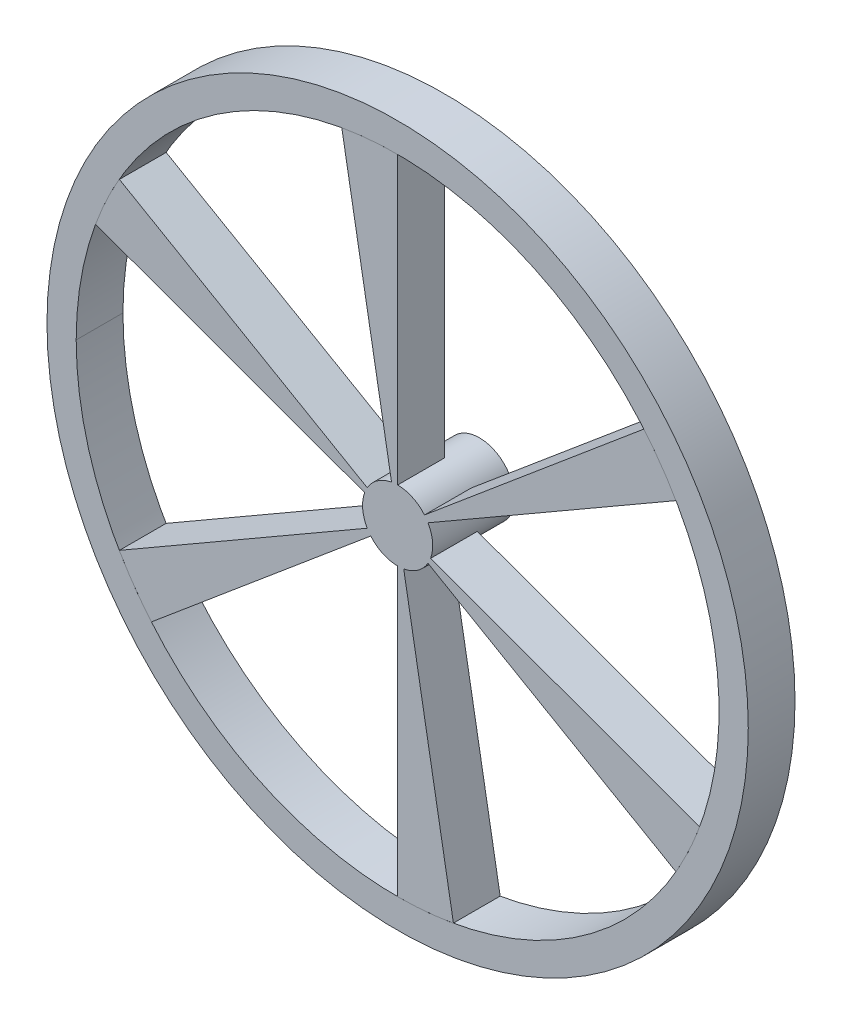
ISO-10303-21;
HEADER;
FILE_DESCRIPTION(('STEP AP214'),'2;1');
FILE_NAME('part.step','',(''),(''),'','','');
FILE_SCHEMA(('AUTOMOTIVE_DESIGN { 1 0 10303 214 1 1 1 1 }'));
ENDSEC;
DATA;
#1=APPLICATION_CONTEXT('core data for automotive mechanical design processes');
#2=APPLICATION_PROTOCOL_DEFINITION('international standard','automotive_design',2000,#1);
#3=PRODUCT_CONTEXT('',#1,'mechanical');
#4=PRODUCT('Part','Part','',(#3));
#5=PRODUCT_RELATED_PRODUCT_CATEGORY('part','',(#4));
#6=PRODUCT_DEFINITION_FORMATION('','',#4);
#7=PRODUCT_DEFINITION_CONTEXT('part definition',#1,'design');
#8=PRODUCT_DEFINITION('design','',#6,#7);
#9=PRODUCT_DEFINITION_SHAPE('','',#8);
#10=(LENGTH_UNIT() NAMED_UNIT(*) SI_UNIT(.MILLI.,.METRE.));
#11=(NAMED_UNIT(*) PLANE_ANGLE_UNIT() SI_UNIT($,.RADIAN.));
#12=(NAMED_UNIT(*) SI_UNIT($,.STERADIAN.) SOLID_ANGLE_UNIT());
#13=UNCERTAINTY_MEASURE_WITH_UNIT(LENGTH_MEASURE(1.E-05),#10,'distance_accuracy_value','');
#14=(GEOMETRIC_REPRESENTATION_CONTEXT(3) GLOBAL_UNCERTAINTY_ASSIGNED_CONTEXT((#13)) GLOBAL_UNIT_ASSIGNED_CONTEXT((#10,
#11,#12)) REPRESENTATION_CONTEXT('',''));
#15=CARTESIAN_POINT('',(0.,0.,0.));
#16=DIRECTION('',(0.,0.,1.));
#17=DIRECTION('',(1.,0.,0.));
#18=AXIS2_PLACEMENT_3D('',#15,#16,#17);
#19=CARTESIAN_POINT('',(0.,-660.141421356237,0.));
#20=DIRECTION('',(0.,0.,1.));
#21=DIRECTION('',(1.,0.,0.));
#22=AXIS2_PLACEMENT_3D('',#19,#20,#21);
#23=PLANE('',#22);
#24=CARTESIAN_POINT('',(0.,0.,0.));
#25=DIRECTION('',(0.,0.,-1.));
#26=DIRECTION('',(-1.,0.,0.));
#27=AXIS2_PLACEMENT_3D('',#24,#25,#26);
#28=CIRCLE('',#27,30.);
#29=CARTESIAN_POINT('',(-28.1901049146424,10.2624551108131,0.));
#30=VERTEX_POINT('',#29);
#31=CARTESIAN_POINT('',(-25.9802620990994,15.0008660170704,0.));
#32=VERTEX_POINT('',#31);
#33=EDGE_CURVE('E359',#30,#32,#28,.T.);
#34=ORIENTED_EDGE('',*,*,#33,.F.);
#35=DIRECTION('',(-0.939692620785909,0.342020143325668,0.));
#36=VECTOR('',#35,1.);
#37=CARTESIAN_POINT('',(212.166036792502,-77.2200260936567,0.));
#38=LINE('',#37,#36);
#39=CARTESIAN_POINT('',(-258.41303102068,94.0567474590781,0.));
#40=VERTEX_POINT('',#39);
#41=EDGE_CURVE('E297',#30,#40,#38,.T.);
#42=ORIENTED_EDGE('',*,*,#41,.T.);
#43=CARTESIAN_POINT('',(0.002,0.,0.));
#44=DIRECTION('',(0.,0.,1.));
#45=DIRECTION('',(1.,0.,0.));
#46=AXIS2_PLACEMENT_3D('',#43,#44,#45);
#47=CIRCLE('',#46,275.);
#48=CARTESIAN_POINT('',(-238.154986040721,137.5,0.));
#49=VERTEX_POINT('',#48);
#50=EDGE_CURVE('E294',#49,#40,#47,.T.);
#51=ORIENTED_EDGE('',*,*,#50,.F.);
#52=DIRECTION('',(-0.866025403784439,0.5,0.));
#53=VECTOR('',#52,1.);
#54=CARTESIAN_POINT('',(285.850120492434,-165.034489313656,0.));
#55=LINE('',#54,#53);
#56=EDGE_CURVE('E298',#32,#49,#55,.T.);
#57=ORIENTED_EDGE('',*,*,#56,.F.);
#58=EDGE_LOOP('',(#34,#42,#51,#57));
#59=FACE_BOUND('',#58,.T.);
#60=ADVANCED_FACE('F121',(#59),#23,.F.);
#61=CARTESIAN_POINT('',(-5.20750562615966,29.5445745468354,0.));
#62=VERTEX_POINT('',#61);
#63=CARTESIAN_POINT('',(0.000999999999722214,29.9999999833333,0.));
#64=VERTEX_POINT('',#63);
#65=EDGE_CURVE('E13',#62,#64,#28,.T.);
#66=ORIENTED_EDGE('',*,*,#65,.F.);
#67=DIRECTION('',(-0.173648177666931,0.984807753012208,0.));
#68=VECTOR('',#67,1.);
#69=CARTESIAN_POINT('',(112.892771466357,-640.235379819764,0.));
#70=LINE('',#69,#68);
#71=CARTESIAN_POINT('',(-47.7511080016003,270.821333239715,0.));
#72=VERTEX_POINT('',#71);
#73=EDGE_CURVE('E292',#62,#72,#70,.T.);
#74=ORIENTED_EDGE('',*,*,#73,.T.);
#75=CARTESIAN_POINT('',(0.00099999999999999,-0.001,0.));
#76=DIRECTION('',(0.,0.,1.));
#77=DIRECTION('',(1.,0.,0.));
#78=AXIS2_PLACEMENT_3D('',#75,#76,#77);
#79=CIRCLE('',#78,275.);
#80=CARTESIAN_POINT('',(0.000999999999999992,274.999,0.));
#81=VERTEX_POINT('',#80);
#82=EDGE_CURVE('E289',#81,#72,#79,.T.);
#83=ORIENTED_EDGE('',*,*,#82,.F.);
#84=DIRECTION('',(0.,1.,0.));
#85=VECTOR('',#84,1.);
#86=CARTESIAN_POINT('',(0.000999999999999992,-660.141421356237,0.));
#87=LINE('',#86,#85);
#88=EDGE_CURVE('E293',#64,#81,#87,.T.);
#89=ORIENTED_EDGE('',*,*,#88,.F.);
#90=EDGE_LOOP('',(#66,#74,#83,#89));
#91=FACE_BOUND('',#90,.T.);
#92=ADVANCED_FACE('F520',(#91),#23,.F.);
#93=CARTESIAN_POINT('',(22.9825992884827,19.2821194360224,0.));
#94=VERTEX_POINT('',#93);
#95=CARTESIAN_POINT('',(25.9812620990994,14.9991339662629,0.));
#96=VERTEX_POINT('',#95);
#97=EDGE_CURVE('E131',#94,#96,#28,.T.);
#98=ORIENTED_EDGE('',*,*,#97,.F.);
#99=DIRECTION('',(0.766044443118977,0.64278760968654,0.));
#100=VECTOR('',#99,1.);
#101=CARTESIAN_POINT('',(-325.054928873618,-272.756042080649,0.));
#102=LINE('',#101,#100);
#103=CARTESIAN_POINT('',(210.663582321936,176.765163078383,0.));
#104=VERTEX_POINT('',#103);
#105=EDGE_CURVE('E315',#94,#104,#102,.T.);
#106=ORIENTED_EDGE('',*,*,#105,.T.);
#107=CARTESIAN_POINT('',(0.00099999999999999,-0.001,0.));
#108=DIRECTION('',(0.,0.,1.));
#109=DIRECTION('',(1.,0.,0.));
#110=AXIS2_PLACEMENT_3D('',#107,#108,#109);
#111=CIRCLE('',#110,275.);
#112=CARTESIAN_POINT('',(238.157803027808,137.499316987176,0.));
#113=VERTEX_POINT('',#112);
#114=EDGE_CURVE('E275',#113,#104,#111,.T.);
#115=ORIENTED_EDGE('',*,*,#114,.F.);
#116=DIRECTION('',(0.866025403784439,0.5,0.));
#117=VECTOR('',#116,1.);
#118=CARTESIAN_POINT('',(-285.849120492434,-165.036221364463,0.));
#119=LINE('',#118,#117);
#120=EDGE_CURVE('E186',#96,#113,#119,.T.);
#121=ORIENTED_EDGE('',*,*,#120,.F.);
#122=EDGE_LOOP('',(#98,#106,#115,#121));
#123=FACE_BOUND('',#122,.T.);
#124=ADVANCED_FACE('F524',(#123),#23,.F.);
#125=CARTESIAN_POINT('',(28.1901049146425,-10.262455110813,0.));
#126=VERTEX_POINT('',#125);
#127=CARTESIAN_POINT('',(25.9802620990995,-15.0008660170703,0.));
#128=VERTEX_POINT('',#127);
#129=EDGE_CURVE('E372',#126,#128,#28,.T.);
#130=ORIENTED_EDGE('',*,*,#129,.F.);
#131=DIRECTION('',(0.939692620785909,-0.342020143325668,0.));
#132=VECTOR('',#131,1.);
#133=CARTESIAN_POINT('',(212.164689496147,-77.2237277599702,0.));
#134=LINE('',#133,#132);
#135=CARTESIAN_POINT('',(258.415358678303,-94.0575946571681,0.));
#136=VERTEX_POINT('',#135);
#137=EDGE_CURVE('E313',#126,#136,#134,.T.);
#138=ORIENTED_EDGE('',*,*,#137,.T.);
#139=CARTESIAN_POINT('',(0.001,0.001,0.));
#140=DIRECTION('',(0.,0.,1.));
#141=DIRECTION('',(1.,0.,0.));
#142=AXIS2_PLACEMENT_3D('',#139,#140,#141);
#143=CIRCLE('',#142,275.);
#144=CARTESIAN_POINT('',(238.156803019204,-137.501049033016,0.));
#145=VERTEX_POINT('',#144);
#146=EDGE_CURVE('E310',#145,#136,#143,.T.);
#147=ORIENTED_EDGE('',*,*,#146,.F.);
#148=DIRECTION('',(0.866025403784439,-0.5,0.));
#149=VECTOR('',#148,1.);
#150=CARTESIAN_POINT('',(285.849120492434,-165.036221364463,0.));
#151=LINE('',#150,#149);
#152=EDGE_CURVE('E314',#128,#145,#151,.T.);
#153=ORIENTED_EDGE('',*,*,#152,.F.);
#154=EDGE_LOOP('',(#130,#138,#147,#153));
#155=FACE_BOUND('',#154,.T.);
#156=ADVANCED_FACE('F532',(#155),#23,.F.);
#157=CARTESIAN_POINT('',(5.20750562615971,-29.5445745468354,0.));
#158=VERTEX_POINT('',#157);
#159=CARTESIAN_POINT('',(-0.000999999999665977,-29.9999999833333,0.));
#160=VERTEX_POINT('',#159);
#161=EDGE_CURVE('E376',#158,#160,#28,.T.);
#162=ORIENTED_EDGE('',*,*,#161,.F.);
#163=DIRECTION('',(0.173648177666931,-0.984807753012208,0.));
#164=VECTOR('',#163,1.);
#165=CARTESIAN_POINT('',(112.888892081115,-640.23606386005,0.));
#166=LINE('',#165,#164);
#167=CARTESIAN_POINT('',(47.751168306314,-270.821675244741,0.));
#168=VERTEX_POINT('',#167);
#169=EDGE_CURVE('E308',#158,#168,#166,.T.);
#170=ORIENTED_EDGE('',*,*,#169,.T.);
#171=CARTESIAN_POINT('',(0.001,0.001,0.));
#172=DIRECTION('',(0.,0.,1.));
#173=DIRECTION('',(1.,0.,0.));
#174=AXIS2_PLACEMENT_3D('',#171,#172,#173);
#175=CIRCLE('',#174,275.);
#176=CARTESIAN_POINT('',(-0.000999999999896918,-274.998999992727,0.));
#177=VERTEX_POINT('',#176);
#178=EDGE_CURVE('E305',#177,#168,#175,.T.);
#179=ORIENTED_EDGE('',*,*,#178,.F.);
#180=DIRECTION('',(0.,-1.,0.));
#181=VECTOR('',#180,1.);
#182=CARTESIAN_POINT('',(-0.00099999999974966,-660.141421356237,0.));
#183=LINE('',#182,#181);
#184=EDGE_CURVE('E309',#160,#177,#183,.T.);
#185=ORIENTED_EDGE('',*,*,#184,.F.);
#186=EDGE_LOOP('',(#162,#170,#179,#185));
#187=FACE_BOUND('',#186,.T.);
#188=ADVANCED_FACE('F526',(#187),#23,.F.);
#189=CARTESIAN_POINT('',(-22.9825992884827,-19.2821194360225,0.));
#190=VERTEX_POINT('',#189);
#191=CARTESIAN_POINT('',(-25.9812620990994,-14.9991339662629,0.));
#192=VERTEX_POINT('',#191);
#193=EDGE_CURVE('E352',#190,#192,#28,.T.);
#194=ORIENTED_EDGE('',*,*,#193,.F.);
#195=DIRECTION('',(-0.766044443118977,-0.64278760968654,0.));
#196=VECTOR('',#195,1.);
#197=CARTESIAN_POINT('',(-325.057460962504,-272.753024454622,0.));
#198=LINE('',#197,#196);
#199=CARTESIAN_POINT('',(-210.662314239226,-176.764099030648,0.));
#200=VERTEX_POINT('',#199);
#201=EDGE_CURVE('E303',#190,#200,#198,.T.);
#202=ORIENTED_EDGE('',*,*,#201,.T.);
#203=CARTESIAN_POINT('',(0.002,0.,0.));
#204=DIRECTION('',(0.,0.,1.));
#205=DIRECTION('',(1.,0.,0.));
#206=AXIS2_PLACEMENT_3D('',#203,#204,#205);
#207=CIRCLE('',#206,275.);
#208=CARTESIAN_POINT('',(-238.155986034422,-137.498267945556,0.));
#209=VERTEX_POINT('',#208);
#210=EDGE_CURVE('E299',#209,#200,#207,.T.);
#211=ORIENTED_EDGE('',*,*,#210,.F.);
#212=DIRECTION('',(-0.866025403784438,-0.5,0.));
#213=VECTOR('',#212,1.);
#214=CARTESIAN_POINT('',(-285.850120492435,-165.034489313656,0.));
#215=LINE('',#214,#213);
#216=EDGE_CURVE('E304',#192,#209,#215,.T.);
#217=ORIENTED_EDGE('',*,*,#216,.F.);
#218=EDGE_LOOP('',(#194,#202,#211,#217));
#219=FACE_BOUND('',#218,.T.);
#220=ADVANCED_FACE('F420',(#219),#23,.F.);
#221=CARTESIAN_POINT('',(0.000999999999999992,-660.141421356237,40.));
#222=DIRECTION('',(-1.,0.,0.));
#223=DIRECTION('',(0.,0.,1.));
#224=AXIS2_PLACEMENT_3D('',#221,#222,#223);
#225=PLANE('',#224);
#226=ORIENTED_EDGE('',*,*,#88,.T.);
#227=DIRECTION('',(0.,0.,-1.));
#228=VECTOR('',#227,1.);
#229=CARTESIAN_POINT('',(0.000999999999999992,274.999,40.));
#230=LINE('',#229,#228);
#231=CARTESIAN_POINT('',(0.000999999999999992,274.999,40.));
#232=VERTEX_POINT('',#231);
#233=EDGE_CURVE('E349',#232,#81,#230,.T.);
#234=ORIENTED_EDGE('',*,*,#233,.F.);
#235=DIRECTION('',(0.,1.,0.));
#236=VECTOR('',#235,1.);
#237=CARTESIAN_POINT('',(0.000999999999999992,-660.141421356237,40.));
#238=LINE('',#237,#236);
#239=CARTESIAN_POINT('',(0.000999999999999992,29.9999999833333,40.));
#240=VERTEX_POINT('',#239);
#241=EDGE_CURVE('E601',#240,#232,#238,.T.);
#242=ORIENTED_EDGE('',*,*,#241,.F.);
#243=DIRECTION('',(0.,0.,-1.));
#244=VECTOR('',#243,1.);
#245=CARTESIAN_POINT('',(0.000999999999999992,29.9999999833333,40.));
#246=LINE('',#245,#244);
#247=EDGE_CURVE('E283',#240,#64,#246,.T.);
#248=ORIENTED_EDGE('',*,*,#247,.T.);
#249=EDGE_LOOP('',(#226,#234,#242,#248));
#250=FACE_BOUND('',#249,.T.);
#251=ADVANCED_FACE('F123',(#250),#225,.F.);
#252=CARTESIAN_POINT('',(0.00099999999999999,-0.001,40.));
#253=DIRECTION('',(0.,0.,-1.));
#254=DIRECTION('',(-1.,0.,0.));
#255=AXIS2_PLACEMENT_3D('',#252,#253,#254);
#256=CYLINDRICAL_SURFACE('',#255,275.);
#257=ORIENTED_EDGE('',*,*,#82,.T.);
#258=DIRECTION('',(0.,0.,-1.));
#259=VECTOR('',#258,1.);
#260=CARTESIAN_POINT('',(-47.7511080016003,270.821333239715,40.));
#261=LINE('',#260,#259);
#262=CARTESIAN_POINT('',(-47.7511080016003,270.821333239715,40.));
#263=VERTEX_POINT('',#262);
#264=EDGE_CURVE('E347',#263,#72,#261,.T.);
#265=ORIENTED_EDGE('',*,*,#264,.F.);
#266=CARTESIAN_POINT('',(0.00099999999999999,-0.001,40.));
#267=DIRECTION('',(0.,0.,1.));
#268=DIRECTION('',(1.,0.,0.));
#269=AXIS2_PLACEMENT_3D('',#266,#267,#268);
#270=CIRCLE('',#269,275.);
#271=EDGE_CURVE('E203',#232,#263,#270,.T.);
#272=ORIENTED_EDGE('',*,*,#271,.F.);
#273=ORIENTED_EDGE('',*,*,#233,.T.);
#274=EDGE_LOOP('',(#257,#265,#272,#273));
#275=FACE_BOUND('',#274,.T.);
#276=ADVANCED_FACE('F531',(#275),#256,.T.);
#277=CARTESIAN_POINT('',(112.892771466357,-640.235379819764,40.));
#278=DIRECTION('',(-0.984807753012208,-0.173648177666931,0.));
#279=DIRECTION('',(0.173648177666931,-0.984807753012208,0.));
#280=AXIS2_PLACEMENT_3D('',#277,#278,#279);
#281=PLANE('',#280);
#282=ORIENTED_EDGE('',*,*,#73,.F.);
#283=DIRECTION('',(0.,0.,-1.));
#284=VECTOR('',#283,1.);
#285=CARTESIAN_POINT('',(-5.20750562615966,29.5445745468354,40.));
#286=LINE('',#285,#284);
#287=CARTESIAN_POINT('',(-5.20750562615966,29.5445745468354,40.));
#288=VERTEX_POINT('',#287);
#289=EDGE_CURVE('E350',#288,#62,#286,.T.);
#290=ORIENTED_EDGE('',*,*,#289,.F.);
#291=DIRECTION('',(-0.173648177666931,0.984807753012208,0.));
#292=VECTOR('',#291,1.);
#293=CARTESIAN_POINT('',(112.892771466357,-640.235379819764,40.));
#294=LINE('',#293,#292);
#295=EDGE_CURVE('E613',#288,#263,#294,.T.);
#296=ORIENTED_EDGE('',*,*,#295,.T.);
#297=ORIENTED_EDGE('',*,*,#264,.T.);
#298=EDGE_LOOP('',(#282,#290,#296,#297));
#299=FACE_BOUND('',#298,.T.);
#300=ADVANCED_FACE('F616',(#299),#281,.T.);
#301=CARTESIAN_POINT('',(285.850120492434,-165.034489313656,40.));
#302=DIRECTION('',(-0.5,-0.866025403784439,0.));
#303=DIRECTION('',(0.866025403784439,-0.5,0.));
#304=AXIS2_PLACEMENT_3D('',#301,#302,#303);
#305=PLANE('',#304);
#306=ORIENTED_EDGE('',*,*,#56,.T.);
#307=DIRECTION('',(0.,0.,-1.));
#308=VECTOR('',#307,1.);
#309=CARTESIAN_POINT('',(-238.154986040721,137.5,40.));
#310=LINE('',#309,#308);
#311=CARTESIAN_POINT('',(-238.154986040721,137.5,40.));
#312=VERTEX_POINT('',#311);
#313=EDGE_CURVE('E342',#312,#49,#310,.T.);
#314=ORIENTED_EDGE('',*,*,#313,.F.);
#315=DIRECTION('',(-0.866025403784439,0.5,0.));
#316=VECTOR('',#315,1.);
#317=CARTESIAN_POINT('',(285.850120492434,-165.034489313656,40.));
#318=LINE('',#317,#316);
#319=CARTESIAN_POINT('',(-25.9802620990994,15.0008660170704,40.));
#320=VERTEX_POINT('',#319);
#321=EDGE_CURVE('E618',#320,#312,#318,.T.);
#322=ORIENTED_EDGE('',*,*,#321,.F.);
#323=DIRECTION('',(0.,0.,-1.));
#324=VECTOR('',#323,1.);
#325=CARTESIAN_POINT('',(-25.9802620990994,15.0008660170704,40.));
#326=LINE('',#325,#324);
#327=EDGE_CURVE('E346',#320,#32,#326,.T.);
#328=ORIENTED_EDGE('',*,*,#327,.T.);
#329=EDGE_LOOP('',(#306,#314,#322,#328));
#330=FACE_BOUND('',#329,.T.);
#331=ADVANCED_FACE('F627',(#330),#305,.F.);
#332=CARTESIAN_POINT('',(0.002,0.,40.));
#333=DIRECTION('',(0.,0.,-1.));
#334=DIRECTION('',(-1.,0.,0.));
#335=AXIS2_PLACEMENT_3D('',#332,#333,#334);
#336=CYLINDRICAL_SURFACE('',#335,275.);
#337=ORIENTED_EDGE('',*,*,#50,.T.);
#338=DIRECTION('',(0.,0.,-1.));
#339=VECTOR('',#338,1.);
#340=CARTESIAN_POINT('',(-258.41303102068,94.0567474590781,40.));
#341=LINE('',#340,#339);
#342=CARTESIAN_POINT('',(-258.41303102068,94.0567474590781,40.));
#343=VERTEX_POINT('',#342);
#344=EDGE_CURVE('E340',#343,#40,#341,.T.);
#345=ORIENTED_EDGE('',*,*,#344,.F.);
#346=CARTESIAN_POINT('',(0.002,0.,40.));
#347=DIRECTION('',(0.,0.,1.));
#348=DIRECTION('',(1.,0.,0.));
#349=AXIS2_PLACEMENT_3D('',#346,#347,#348);
#350=CIRCLE('',#349,275.);
#351=EDGE_CURVE('E619',#312,#343,#350,.T.);
#352=ORIENTED_EDGE('',*,*,#351,.F.);
#353=ORIENTED_EDGE('',*,*,#313,.T.);
#354=EDGE_LOOP('',(#337,#345,#352,#353));
#355=FACE_BOUND('',#354,.T.);
#356=ADVANCED_FACE('F626',(#355),#336,.T.);
#357=CARTESIAN_POINT('',(212.166036792502,-77.2200260936567,40.));
#358=DIRECTION('',(-0.342020143325668,-0.939692620785909,0.));
#359=DIRECTION('',(0.939692620785909,-0.342020143325668,0.));
#360=AXIS2_PLACEMENT_3D('',#357,#358,#359);
#361=PLANE('',#360);
#362=ORIENTED_EDGE('',*,*,#41,.F.);
#363=DIRECTION('',(0.,0.,-1.));
#364=VECTOR('',#363,1.);
#365=CARTESIAN_POINT('',(-28.1901049146424,10.2624551108131,40.));
#366=LINE('',#365,#364);
#367=CARTESIAN_POINT('',(-28.1901049146424,10.2624551108131,40.));
#368=VERTEX_POINT('',#367);
#369=EDGE_CURVE('E343',#368,#30,#366,.T.);
#370=ORIENTED_EDGE('',*,*,#369,.F.);
#371=DIRECTION('',(-0.939692620785909,0.342020143325668,0.));
#372=VECTOR('',#371,1.);
#373=CARTESIAN_POINT('',(212.166036792502,-77.2200260936567,40.));
#374=LINE('',#373,#372);
#375=EDGE_CURVE('E620',#368,#343,#374,.T.);
#376=ORIENTED_EDGE('',*,*,#375,.T.);
#377=ORIENTED_EDGE('',*,*,#344,.T.);
#378=EDGE_LOOP('',(#362,#370,#376,#377));
#379=FACE_BOUND('',#378,.T.);
#380=ADVANCED_FACE('F473',(#379),#361,.T.);
#381=CARTESIAN_POINT('',(-285.850120492435,-165.034489313656,40.));
#382=DIRECTION('',(0.5,-0.866025403784438,0.));
#383=DIRECTION('',(0.866025403784438,0.5,0.));
#384=AXIS2_PLACEMENT_3D('',#381,#382,#383);
#385=PLANE('',#384);
#386=ORIENTED_EDGE('',*,*,#216,.T.);
#387=DIRECTION('',(0.,0.,-1.));
#388=VECTOR('',#387,1.);
#389=CARTESIAN_POINT('',(-238.155986034422,-137.498267945556,40.));
#390=LINE('',#389,#388);
#391=CARTESIAN_POINT('',(-238.155986034422,-137.498267945556,40.));
#392=VERTEX_POINT('',#391);
#393=EDGE_CURVE('E335',#392,#209,#390,.T.);
#394=ORIENTED_EDGE('',*,*,#393,.F.);
#395=DIRECTION('',(-0.866025403784438,-0.5,0.));
#396=VECTOR('',#395,1.);
#397=CARTESIAN_POINT('',(-285.850120492435,-165.034489313656,40.));
#398=LINE('',#397,#396);
#399=CARTESIAN_POINT('',(-25.9812620990994,-14.9991339662629,40.));
#400=VERTEX_POINT('',#399);
#401=EDGE_CURVE('E566',#400,#392,#398,.T.);
#402=ORIENTED_EDGE('',*,*,#401,.F.);
#403=DIRECTION('',(0.,0.,-1.));
#404=VECTOR('',#403,1.);
#405=CARTESIAN_POINT('',(-25.9812620990994,-14.9991339662629,40.));
#406=LINE('',#405,#404);
#407=EDGE_CURVE('E339',#400,#192,#406,.T.);
#408=ORIENTED_EDGE('',*,*,#407,.T.);
#409=EDGE_LOOP('',(#386,#394,#402,#408));
#410=FACE_BOUND('',#409,.T.);
#411=ADVANCED_FACE('F663',(#410),#385,.F.);
#412=CARTESIAN_POINT('',(0.002,0.,40.));
#413=DIRECTION('',(0.,0.,-1.));
#414=DIRECTION('',(-1.,0.,0.));
#415=AXIS2_PLACEMENT_3D('',#412,#413,#414);
#416=CYLINDRICAL_SURFACE('',#415,275.);
#417=ORIENTED_EDGE('',*,*,#210,.T.);
#418=DIRECTION('',(0.,0.,-1.));
#419=VECTOR('',#418,1.);
#420=CARTESIAN_POINT('',(-210.662314239226,-176.764099030648,40.));
#421=LINE('',#420,#419);
#422=CARTESIAN_POINT('',(-210.662314239226,-176.764099030648,40.));
#423=VERTEX_POINT('',#422);
#424=EDGE_CURVE('E333',#423,#200,#421,.T.);
#425=ORIENTED_EDGE('',*,*,#424,.F.);
#426=CARTESIAN_POINT('',(0.002,0.,40.));
#427=DIRECTION('',(0.,0.,1.));
#428=DIRECTION('',(1.,0.,0.));
#429=AXIS2_PLACEMENT_3D('',#426,#427,#428);
#430=CIRCLE('',#429,275.);
#431=EDGE_CURVE('E563',#392,#423,#430,.T.);
#432=ORIENTED_EDGE('',*,*,#431,.F.);
#433=ORIENTED_EDGE('',*,*,#393,.T.);
#434=EDGE_LOOP('',(#417,#425,#432,#433));
#435=FACE_BOUND('',#434,.T.);
#436=ADVANCED_FACE('F671',(#435),#416,.T.);
#437=CARTESIAN_POINT('',(-325.057460962504,-272.753024454622,40.));
#438=DIRECTION('',(0.64278760968654,-0.766044443118977,0.));
#439=DIRECTION('',(0.766044443118977,0.64278760968654,0.));
#440=AXIS2_PLACEMENT_3D('',#437,#438,#439);
#441=PLANE('',#440);
#442=ORIENTED_EDGE('',*,*,#201,.F.);
#443=DIRECTION('',(0.,0.,-1.));
#444=VECTOR('',#443,1.);
#445=CARTESIAN_POINT('',(-22.9825992884827,-19.2821194360225,40.));
#446=LINE('',#445,#444);
#447=CARTESIAN_POINT('',(-22.9825992884827,-19.2821194360225,40.));
#448=VERTEX_POINT('',#447);
#449=EDGE_CURVE('E336',#448,#190,#446,.T.);
#450=ORIENTED_EDGE('',*,*,#449,.F.);
#451=DIRECTION('',(-0.766044443118977,-0.64278760968654,0.));
#452=VECTOR('',#451,1.);
#453=CARTESIAN_POINT('',(-325.057460962504,-272.753024454622,40.));
#454=LINE('',#453,#452);
#455=EDGE_CURVE('E561',#448,#423,#454,.T.);
#456=ORIENTED_EDGE('',*,*,#455,.T.);
#457=ORIENTED_EDGE('',*,*,#424,.T.);
#458=EDGE_LOOP('',(#442,#450,#456,#457));
#459=FACE_BOUND('',#458,.T.);
#460=ADVANCED_FACE('F423',(#459),#441,.T.);
#461=CARTESIAN_POINT('',(-0.00099999999974966,-660.141421356237,40.));
#462=DIRECTION('',(1.,0.,0.));
#463=DIRECTION('',(0.,1.,0.));
#464=AXIS2_PLACEMENT_3D('',#461,#462,#463);
#465=PLANE('',#464);
#466=ORIENTED_EDGE('',*,*,#184,.T.);
#467=DIRECTION('',(0.,0.,-1.));
#468=VECTOR('',#467,1.);
#469=CARTESIAN_POINT('',(-0.000999999999896918,-274.998999992727,40.));
#470=LINE('',#469,#468);
#471=CARTESIAN_POINT('',(-0.000999999999896918,-274.998999992727,40.));
#472=VERTEX_POINT('',#471);
#473=EDGE_CURVE('E328',#472,#177,#470,.T.);
#474=ORIENTED_EDGE('',*,*,#473,.F.);
#475=DIRECTION('',(0.,-1.,0.));
#476=VECTOR('',#475,1.);
#477=CARTESIAN_POINT('',(-0.00099999999974966,-660.141421356237,40.));
#478=LINE('',#477,#476);
#479=CARTESIAN_POINT('',(-0.000999999999990591,-29.9999999833333,40.));
#480=VERTEX_POINT('',#479);
#481=EDGE_CURVE('E558',#480,#472,#478,.T.);
#482=ORIENTED_EDGE('',*,*,#481,.F.);
#483=DIRECTION('',(0.,0.,-1.));
#484=VECTOR('',#483,1.);
#485=CARTESIAN_POINT('',(-0.000999999999990591,-29.9999999833333,40.));
#486=LINE('',#485,#484);
#487=EDGE_CURVE('E332',#480,#160,#486,.T.);
#488=ORIENTED_EDGE('',*,*,#487,.T.);
#489=EDGE_LOOP('',(#466,#474,#482,#488));
#490=FACE_BOUND('',#489,.T.);
#491=ADVANCED_FACE('F557',(#490),#465,.F.);
#492=CARTESIAN_POINT('',(0.001,0.001,40.));
#493=DIRECTION('',(0.,0.,-1.));
#494=DIRECTION('',(-1.,0.,0.));
#495=AXIS2_PLACEMENT_3D('',#492,#493,#494);
#496=CYLINDRICAL_SURFACE('',#495,275.);
#497=ORIENTED_EDGE('',*,*,#178,.T.);
#498=DIRECTION('',(0.,0.,-1.));
#499=VECTOR('',#498,1.);
#500=CARTESIAN_POINT('',(47.751168306314,-270.821675244741,40.));
#501=LINE('',#500,#499);
#502=CARTESIAN_POINT('',(47.751168306314,-270.821675244741,40.));
#503=VERTEX_POINT('',#502);
#504=EDGE_CURVE('E326',#503,#168,#501,.T.);
#505=ORIENTED_EDGE('',*,*,#504,.F.);
#506=CARTESIAN_POINT('',(0.001,0.001,40.));
#507=DIRECTION('',(0.,0.,1.));
#508=DIRECTION('',(1.,0.,0.));
#509=AXIS2_PLACEMENT_3D('',#506,#507,#508);
#510=CIRCLE('',#509,275.);
#511=EDGE_CURVE('E554',#472,#503,#510,.T.);
#512=ORIENTED_EDGE('',*,*,#511,.F.);
#513=ORIENTED_EDGE('',*,*,#473,.T.);
#514=EDGE_LOOP('',(#497,#505,#512,#513));
#515=FACE_BOUND('',#514,.T.);
#516=ADVANCED_FACE('F552',(#515),#496,.T.);
#517=CARTESIAN_POINT('',(112.888892081115,-640.23606386005,40.));
#518=DIRECTION('',(0.984807753012208,0.173648177666931,0.));
#519=DIRECTION('',(-0.173648177666931,0.984807753012208,0.));
#520=AXIS2_PLACEMENT_3D('',#517,#518,#519);
#521=PLANE('',#520);
#522=ORIENTED_EDGE('',*,*,#169,.F.);
#523=DIRECTION('',(0.,0.,-1.));
#524=VECTOR('',#523,1.);
#525=CARTESIAN_POINT('',(5.2075056261597,-29.5445745468354,40.));
#526=LINE('',#525,#524);
#527=CARTESIAN_POINT('',(5.2075056261597,-29.5445745468354,40.));
#528=VERTEX_POINT('',#527);
#529=EDGE_CURVE('E329',#528,#158,#526,.T.);
#530=ORIENTED_EDGE('',*,*,#529,.F.);
#531=DIRECTION('',(0.173648177666931,-0.984807753012208,0.));
#532=VECTOR('',#531,1.);
#533=CARTESIAN_POINT('',(112.888892081115,-640.23606386005,40.));
#534=LINE('',#533,#532);
#535=EDGE_CURVE('E549',#528,#503,#534,.T.);
#536=ORIENTED_EDGE('',*,*,#535,.T.);
#537=ORIENTED_EDGE('',*,*,#504,.T.);
#538=EDGE_LOOP('',(#522,#530,#536,#537));
#539=FACE_BOUND('',#538,.T.);
#540=ADVANCED_FACE('F547',(#539),#521,.T.);
#541=CARTESIAN_POINT('',(285.849120492434,-165.036221364463,40.));
#542=DIRECTION('',(0.5,0.866025403784439,0.));
#543=DIRECTION('',(-0.866025403784439,0.5,0.));
#544=AXIS2_PLACEMENT_3D('',#541,#542,#543);
#545=PLANE('',#544);
#546=ORIENTED_EDGE('',*,*,#152,.T.);
#547=DIRECTION('',(0.,0.,-1.));
#548=VECTOR('',#547,1.);
#549=CARTESIAN_POINT('',(238.156803019204,-137.501049033016,40.));
#550=LINE('',#549,#548);
#551=CARTESIAN_POINT('',(238.156803019204,-137.501049033016,40.));
#552=VERTEX_POINT('',#551);
#553=EDGE_CURVE('E321',#552,#145,#550,.T.);
#554=ORIENTED_EDGE('',*,*,#553,.F.);
#555=DIRECTION('',(0.866025403784439,-0.5,0.));
#556=VECTOR('',#555,1.);
#557=CARTESIAN_POINT('',(285.849120492434,-165.036221364463,40.));
#558=LINE('',#557,#556);
#559=CARTESIAN_POINT('',(25.9802620990995,-15.0008660170703,40.));
#560=VERTEX_POINT('',#559);
#561=EDGE_CURVE('E573',#560,#552,#558,.T.);
#562=ORIENTED_EDGE('',*,*,#561,.F.);
#563=DIRECTION('',(0.,0.,-1.));
#564=VECTOR('',#563,1.);
#565=CARTESIAN_POINT('',(25.9802620990995,-15.0008660170703,40.));
#566=LINE('',#565,#564);
#567=EDGE_CURVE('E325',#560,#128,#566,.T.);
#568=ORIENTED_EDGE('',*,*,#567,.T.);
#569=EDGE_LOOP('',(#546,#554,#562,#568));
#570=FACE_BOUND('',#569,.T.);
#571=ADVANCED_FACE('F589',(#570),#545,.F.);
#572=CARTESIAN_POINT('',(0.001,0.001,40.));
#573=DIRECTION('',(0.,0.,-1.));
#574=DIRECTION('',(-1.,0.,0.));
#575=AXIS2_PLACEMENT_3D('',#572,#573,#574);
#576=CYLINDRICAL_SURFACE('',#575,275.);
#577=ORIENTED_EDGE('',*,*,#146,.T.);
#578=DIRECTION('',(0.,0.,-1.));
#579=VECTOR('',#578,1.);
#580=CARTESIAN_POINT('',(258.415358678303,-94.0575946571681,40.));
#581=LINE('',#580,#579);
#582=CARTESIAN_POINT('',(258.415358678303,-94.0575946571681,40.));
#583=VERTEX_POINT('',#582);
#584=EDGE_CURVE('E319',#583,#136,#581,.T.);
#585=ORIENTED_EDGE('',*,*,#584,.F.);
#586=CARTESIAN_POINT('',(0.001,0.001,40.));
#587=DIRECTION('',(0.,0.,1.));
#588=DIRECTION('',(1.,0.,0.));
#589=AXIS2_PLACEMENT_3D('',#586,#587,#588);
#590=CIRCLE('',#589,275.);
#591=EDGE_CURVE('E575',#552,#583,#590,.T.);
#592=ORIENTED_EDGE('',*,*,#591,.F.);
#593=ORIENTED_EDGE('',*,*,#553,.T.);
#594=EDGE_LOOP('',(#577,#585,#592,#593));
#595=FACE_BOUND('',#594,.T.);
#596=ADVANCED_FACE('F594',(#595),#576,.T.);
#597=CARTESIAN_POINT('',(212.164689496147,-77.2237277599702,40.));
#598=DIRECTION('',(0.342020143325668,0.939692620785909,0.));
#599=DIRECTION('',(-0.939692620785909,0.342020143325668,0.));
#600=AXIS2_PLACEMENT_3D('',#597,#598,#599);
#601=PLANE('',#600);
#602=ORIENTED_EDGE('',*,*,#137,.F.);
#603=DIRECTION('',(0.,0.,-1.));
#604=VECTOR('',#603,1.);
#605=CARTESIAN_POINT('',(28.1901049146425,-10.2624551108129,40.));
#606=LINE('',#605,#604);
#607=CARTESIAN_POINT('',(28.1901049146425,-10.2624551108129,40.));
#608=VERTEX_POINT('',#607);
#609=EDGE_CURVE('E322',#608,#126,#606,.T.);
#610=ORIENTED_EDGE('',*,*,#609,.F.);
#611=DIRECTION('',(0.939692620785909,-0.342020143325668,0.));
#612=VECTOR('',#611,1.);
#613=CARTESIAN_POINT('',(212.164689496147,-77.2237277599702,40.));
#614=LINE('',#613,#612);
#615=EDGE_CURVE('E577',#608,#583,#614,.T.);
#616=ORIENTED_EDGE('',*,*,#615,.T.);
#617=ORIENTED_EDGE('',*,*,#584,.T.);
#618=EDGE_LOOP('',(#602,#610,#616,#617));
#619=FACE_BOUND('',#618,.T.);
#620=ADVANCED_FACE('F597',(#619),#601,.T.);
#621=CARTESIAN_POINT('',(-285.849120492434,-165.036221364463,40.));
#622=DIRECTION('',(-0.5,0.866025403784439,0.));
#623=DIRECTION('',(-0.866025403784439,-0.5,0.));
#624=AXIS2_PLACEMENT_3D('',#621,#622,#623);
#625=PLANE('',#624);
#626=ORIENTED_EDGE('',*,*,#120,.T.);
#627=DIRECTION('',(0.,0.,-1.));
#628=VECTOR('',#627,1.);
#629=CARTESIAN_POINT('',(238.157803027808,137.499316987176,40.));
#630=LINE('',#629,#628);
#631=CARTESIAN_POINT('',(238.157803027808,137.499316987176,40.));
#632=VERTEX_POINT('',#631);
#633=EDGE_CURVE('E277',#632,#113,#630,.T.);
#634=ORIENTED_EDGE('',*,*,#633,.F.);
#635=DIRECTION('',(0.866025403784439,0.5,0.));
#636=VECTOR('',#635,1.);
#637=CARTESIAN_POINT('',(-285.849120492434,-165.036221364463,40.));
#638=LINE('',#637,#636);
#639=CARTESIAN_POINT('',(25.9812620990994,14.9991339662629,40.));
#640=VERTEX_POINT('',#639);
#641=EDGE_CURVE('E270',#640,#632,#638,.T.);
#642=ORIENTED_EDGE('',*,*,#641,.F.);
#643=DIRECTION('',(0.,0.,-1.));
#644=VECTOR('',#643,1.);
#645=CARTESIAN_POINT('',(25.9812620990994,14.9991339662629,40.));
#646=LINE('',#645,#644);
#647=EDGE_CURVE('E318',#640,#96,#646,.T.);
#648=ORIENTED_EDGE('',*,*,#647,.T.);
#649=EDGE_LOOP('',(#626,#634,#642,#648));
#650=FACE_BOUND('',#649,.T.);
#651=ADVANCED_FACE('F599',(#650),#625,.F.);
#652=CARTESIAN_POINT('',(0.00099999999999999,-0.001,40.));
#653=DIRECTION('',(0.,0.,-1.));
#654=DIRECTION('',(-1.,0.,0.));
#655=AXIS2_PLACEMENT_3D('',#652,#653,#654);
#656=CYLINDRICAL_SURFACE('',#655,275.);
#657=ORIENTED_EDGE('',*,*,#114,.T.);
#658=DIRECTION('',(0.,0.,-1.));
#659=VECTOR('',#658,1.);
#660=CARTESIAN_POINT('',(210.663582321936,176.765163078383,40.));
#661=LINE('',#660,#659);
#662=CARTESIAN_POINT('',(210.663582321936,176.765163078383,40.));
#663=VERTEX_POINT('',#662);
#664=EDGE_CURVE('E194',#663,#104,#661,.T.);
#665=ORIENTED_EDGE('',*,*,#664,.F.);
#666=CARTESIAN_POINT('',(0.00099999999999999,-0.001,40.));
#667=DIRECTION('',(0.,0.,1.));
#668=DIRECTION('',(1.,0.,0.));
#669=AXIS2_PLACEMENT_3D('',#666,#667,#668);
#670=CIRCLE('',#669,275.);
#671=EDGE_CURVE('E266',#632,#663,#670,.T.);
#672=ORIENTED_EDGE('',*,*,#671,.F.);
#673=ORIENTED_EDGE('',*,*,#633,.T.);
#674=EDGE_LOOP('',(#657,#665,#672,#673));
#675=FACE_BOUND('',#674,.T.);
#676=ADVANCED_FACE('F273',(#675),#656,.T.);
#677=CARTESIAN_POINT('',(-325.054928873618,-272.756042080649,40.));
#678=DIRECTION('',(-0.64278760968654,0.766044443118977,0.));
#679=DIRECTION('',(-0.766044443118977,-0.64278760968654,0.));
#680=AXIS2_PLACEMENT_3D('',#677,#678,#679);
#681=PLANE('',#680);
#682=ORIENTED_EDGE('',*,*,#105,.F.);
#683=DIRECTION('',(0.,0.,-1.));
#684=VECTOR('',#683,1.);
#685=CARTESIAN_POINT('',(22.9825992884827,19.2821194360224,40.));
#686=LINE('',#685,#684);
#687=CARTESIAN_POINT('',(22.9825992884827,19.2821194360224,40.));
#688=VERTEX_POINT('',#687);
#689=EDGE_CURVE('E278',#688,#94,#686,.T.);
#690=ORIENTED_EDGE('',*,*,#689,.F.);
#691=DIRECTION('',(0.766044443118977,0.64278760968654,0.));
#692=VECTOR('',#691,1.);
#693=CARTESIAN_POINT('',(-325.054928873618,-272.756042080649,40.));
#694=LINE('',#693,#692);
#695=EDGE_CURVE('E268',#688,#663,#694,.T.);
#696=ORIENTED_EDGE('',*,*,#695,.T.);
#697=ORIENTED_EDGE('',*,*,#664,.T.);
#698=EDGE_LOOP('',(#682,#690,#696,#697));
#699=FACE_BOUND('',#698,.T.);
#700=ADVANCED_FACE('F280',(#699),#681,.T.);
#701=CARTESIAN_POINT('',(0.,0.,40.));
#702=DIRECTION('',(0.,0.,-1.));
#703=DIRECTION('',(-1.,0.,0.));
#704=AXIS2_PLACEMENT_3D('',#701,#702,#703);
#705=CYLINDRICAL_SURFACE('',#704,30.);
#706=ORIENTED_EDGE('',*,*,#689,.T.);
#707=ORIENTED_EDGE('',*,*,#97,.T.);
#708=ORIENTED_EDGE('',*,*,#647,.F.);
#709=CARTESIAN_POINT('',(0.,0.,40.));
#710=DIRECTION('',(0.,0.,1.));
#711=DIRECTION('',(1.,0.,0.));
#712=AXIS2_PLACEMENT_3D('',#709,#710,#711);
#713=CIRCLE('',#712,30.);
#714=EDGE_CURVE('E285',#608,#640,#713,.T.);
#715=ORIENTED_EDGE('',*,*,#714,.F.);
#716=ORIENTED_EDGE('',*,*,#609,.T.);
#717=ORIENTED_EDGE('',*,*,#129,.T.);
#718=ORIENTED_EDGE('',*,*,#567,.F.);
#719=EDGE_CURVE('E543',#528,#560,#713,.T.);
#720=ORIENTED_EDGE('',*,*,#719,.F.);
#721=ORIENTED_EDGE('',*,*,#529,.T.);
#722=ORIENTED_EDGE('',*,*,#161,.T.);
#723=ORIENTED_EDGE('',*,*,#487,.F.);
#724=EDGE_CURVE('E559',#448,#480,#713,.T.);
#725=ORIENTED_EDGE('',*,*,#724,.F.);
#726=ORIENTED_EDGE('',*,*,#449,.T.);
#727=ORIENTED_EDGE('',*,*,#193,.T.);
#728=ORIENTED_EDGE('',*,*,#407,.F.);
#729=EDGE_CURVE('E468',#368,#400,#713,.T.);
#730=ORIENTED_EDGE('',*,*,#729,.F.);
#731=ORIENTED_EDGE('',*,*,#369,.T.);
#732=ORIENTED_EDGE('',*,*,#33,.T.);
#733=ORIENTED_EDGE('',*,*,#327,.F.);
#734=EDGE_CURVE('E286',#288,#320,#713,.T.);
#735=ORIENTED_EDGE('',*,*,#734,.F.);
#736=ORIENTED_EDGE('',*,*,#289,.T.);
#737=ORIENTED_EDGE('',*,*,#65,.T.);
#738=ORIENTED_EDGE('',*,*,#247,.F.);
#739=EDGE_CURVE('E140',#688,#240,#713,.T.);
#740=ORIENTED_EDGE('',*,*,#739,.F.);
#741=EDGE_LOOP('',(#706,#707,#708,#715,#716,#717,#718,#720,#721,#722,#723,#725,#726,#727,#728,
#730,#731,#732,#733,#735,#736,#737,#738,#740));
#742=FACE_BOUND('',#741,.T.);
#743=CARTESIAN_POINT('',(0.,0.,-30.));
#744=DIRECTION('',(0.,0.,-1.));
#745=DIRECTION('',(-1.,0.,0.));
#746=AXIS2_PLACEMENT_3D('',#743,#744,#745);
#747=CIRCLE('',#746,30.);
#748=CARTESIAN_POINT('',(-30.,0.,-30.));
#749=VERTEX_POINT('',#748);
#750=EDGE_CURVE('E463',#749,#749,#747,.T.);
#751=ORIENTED_EDGE('',*,*,#750,.F.);
#752=EDGE_LOOP('',(#751));
#753=FACE_BOUND('',#752,.T.);
#754=ADVANCED_FACE('F465',(#742,#753),#705,.T.);
#755=CARTESIAN_POINT('',(0.,-660.141421356237,40.));
#756=DIRECTION('',(0.,0.,1.));
#757=DIRECTION('',(1.,0.,0.));
#758=AXIS2_PLACEMENT_3D('',#755,#756,#757);
#759=PLANE('',#758);
#760=ORIENTED_EDGE('',*,*,#241,.T.);
#761=ORIENTED_EDGE('',*,*,#271,.T.);
#762=ORIENTED_EDGE('',*,*,#295,.F.);
#763=ORIENTED_EDGE('',*,*,#734,.T.);
#764=ORIENTED_EDGE('',*,*,#321,.T.);
#765=ORIENTED_EDGE('',*,*,#351,.T.);
#766=ORIENTED_EDGE('',*,*,#375,.F.);
#767=ORIENTED_EDGE('',*,*,#729,.T.);
#768=ORIENTED_EDGE('',*,*,#401,.T.);
#769=ORIENTED_EDGE('',*,*,#431,.T.);
#770=ORIENTED_EDGE('',*,*,#455,.F.);
#771=ORIENTED_EDGE('',*,*,#724,.T.);
#772=ORIENTED_EDGE('',*,*,#481,.T.);
#773=ORIENTED_EDGE('',*,*,#511,.T.);
#774=ORIENTED_EDGE('',*,*,#535,.F.);
#775=ORIENTED_EDGE('',*,*,#719,.T.);
#776=ORIENTED_EDGE('',*,*,#561,.T.);
#777=ORIENTED_EDGE('',*,*,#591,.T.);
#778=ORIENTED_EDGE('',*,*,#615,.F.);
#779=ORIENTED_EDGE('',*,*,#714,.T.);
#780=ORIENTED_EDGE('',*,*,#641,.T.);
#781=ORIENTED_EDGE('',*,*,#671,.T.);
#782=ORIENTED_EDGE('',*,*,#695,.F.);
#783=ORIENTED_EDGE('',*,*,#739,.T.);
#784=EDGE_LOOP('',(#760,#761,#762,#763,#764,#765,#766,#767,#768,#769,#770,#771,#772,#773,#774,
#775,#776,#777,#778,#779,#780,#781,#782,#783));
#785=FACE_BOUND('',#784,.T.);
#786=ADVANCED_FACE('F267',(#785),#759,.T.);
#787=CARTESIAN_POINT('',(0.,0.,-30.));
#788=DIRECTION('',(0.,0.,-1.));
#789=DIRECTION('',(-1.,0.,0.));
#790=AXIS2_PLACEMENT_3D('',#787,#788,#789);
#791=PLANE('',#790);
#792=ORIENTED_EDGE('',*,*,#750,.T.);
#793=EDGE_LOOP('',(#792));
#794=FACE_BOUND('',#793,.T.);
#795=ADVANCED_FACE('F509',(#794),#791,.T.);
#796=CLOSED_SHELL('',(#60,#92,#124,#156,#188,#220,#251,#276,#300,#331,#356,#380,#411,#436,#460,
#491,#516,#540,#571,#596,#620,#651,#676,#700,#754,#786,#795));
#797=MANIFOLD_SOLID_BREP('B2',#796);
#798=CARTESIAN_POINT('',(0.00099999999999999,-0.001,40.));
#799=DIRECTION('',(0.,0.,-1.));
#800=DIRECTION('',(-1.,0.,0.));
#801=AXIS2_PLACEMENT_3D('',#798,#799,#800);
#802=CYLINDRICAL_SURFACE('',#801,275.);
#803=CARTESIAN_POINT('',(0.00099999999999999,-0.001,0.));
#804=DIRECTION('',(0.,0.,1.));
#805=DIRECTION('',(1.,0.,0.));
#806=AXIS2_PLACEMENT_3D('',#803,#804,#805);
#807=CIRCLE('',#806,275.);
#808=CARTESIAN_POINT('',(-274.998999998182,1.89258924152133E-12,0.));
#809=VERTEX_POINT('',#808);
#810=CARTESIAN_POINT('',(194.455864825656,-194.454864825659,0.));
#811=VERTEX_POINT('',#810);
#812=EDGE_CURVE('E1007',#809,#811,#807,.T.);
#813=ORIENTED_EDGE('',*,*,#812,.F.);
#814=DIRECTION('',(0.,0.,-1.));
#815=VECTOR('',#814,1.);
#816=CARTESIAN_POINT('',(-274.998999998182,1.89258924152133E-12,40.));
#817=LINE('',#816,#815);
#818=CARTESIAN_POINT('',(-274.998999998182,1.89258924152133E-12,40.));
#819=VERTEX_POINT('',#818);
#820=EDGE_CURVE('E119',#819,#809,#817,.T.);
#821=ORIENTED_EDGE('',*,*,#820,.F.);
#822=CARTESIAN_POINT('',(0.00099999999999999,-0.001,40.));
#823=DIRECTION('',(0.,0.,1.));
#824=DIRECTION('',(1.,0.,0.));
#825=AXIS2_PLACEMENT_3D('',#822,#823,#824);
#826=CIRCLE('',#825,275.);
#827=CARTESIAN_POINT('',(194.455864825656,-194.454864825659,40.));
#828=VERTEX_POINT('',#827);
#829=EDGE_CURVE('E1005',#819,#828,#826,.T.);
#830=ORIENTED_EDGE('',*,*,#829,.T.);
#831=DIRECTION('',(0.,0.,-1.));
#832=VECTOR('',#831,1.);
#833=CARTESIAN_POINT('',(194.455864825656,-194.454864825659,40.));
#834=LINE('',#833,#832);
#835=EDGE_CURVE('E989',#828,#811,#834,.T.);
#836=ORIENTED_EDGE('',*,*,#835,.T.);
#837=EDGE_LOOP('',(#813,#821,#830,#836));
#838=FACE_BOUND('',#837,.T.);
#839=ADVANCED_FACE('F973',(#838),#802,.F.);
#840=CARTESIAN_POINT('',(0.001,0.001,40.));
#841=DIRECTION('',(0.,0.,-1.));
#842=DIRECTION('',(-1.,0.,0.));
#843=AXIS2_PLACEMENT_3D('',#840,#841,#842);
#844=CYLINDRICAL_SURFACE('',#843,275.);
#845=CARTESIAN_POINT('',(0.001,0.001,0.));
#846=DIRECTION('',(0.,0.,1.));
#847=DIRECTION('',(1.,0.,0.));
#848=AXIS2_PLACEMENT_3D('',#845,#846,#847);
#849=CIRCLE('',#848,275.);
#850=CARTESIAN_POINT('',(194.455864825659,194.454864825657,0.));
#851=VERTEX_POINT('',#850);
#852=EDGE_CURVE('E1030',#851,#809,#849,.T.);
#853=ORIENTED_EDGE('',*,*,#852,.F.);
#854=DIRECTION('',(0.,0.,-1.));
#855=VECTOR('',#854,1.);
#856=CARTESIAN_POINT('',(194.455864825659,194.454864825657,40.));
#857=LINE('',#856,#855);
#858=CARTESIAN_POINT('',(194.455864825659,194.454864825657,40.));
#859=VERTEX_POINT('',#858);
#860=EDGE_CURVE('E981',#859,#851,#857,.T.);
#861=ORIENTED_EDGE('',*,*,#860,.F.);
#862=CARTESIAN_POINT('',(0.001,0.001,40.));
#863=DIRECTION('',(0.,0.,1.));
#864=DIRECTION('',(1.,0.,0.));
#865=AXIS2_PLACEMENT_3D('',#862,#863,#864);
#866=CIRCLE('',#865,275.);
#867=EDGE_CURVE('E1015',#859,#819,#866,.T.);
#868=ORIENTED_EDGE('',*,*,#867,.T.);
#869=ORIENTED_EDGE('',*,*,#820,.T.);
#870=EDGE_LOOP('',(#853,#861,#868,#869));
#871=FACE_BOUND('',#870,.T.);
#872=ADVANCED_FACE('F1020',(#871),#844,.F.);
#873=CARTESIAN_POINT('',(0.002,0.,40.));
#874=DIRECTION('',(0.,0.,-1.));
#875=DIRECTION('',(-1.,0.,0.));
#876=AXIS2_PLACEMENT_3D('',#873,#874,#875);
#877=CYLINDRICAL_SURFACE('',#876,275.);
#878=CARTESIAN_POINT('',(0.002,0.,0.));
#879=DIRECTION('',(0.,0.,1.));
#880=DIRECTION('',(1.,0.,0.));
#881=AXIS2_PLACEMENT_3D('',#878,#879,#880);
#882=CIRCLE('',#881,275.);
#883=EDGE_CURVE('E1032',#811,#851,#882,.T.);
#884=ORIENTED_EDGE('',*,*,#883,.F.);
#885=ORIENTED_EDGE('',*,*,#835,.F.);
#886=CARTESIAN_POINT('',(0.002,0.,40.));
#887=DIRECTION('',(0.,0.,1.));
#888=DIRECTION('',(1.,0.,0.));
#889=AXIS2_PLACEMENT_3D('',#886,#887,#888);
#890=CIRCLE('',#889,275.);
#891=EDGE_CURVE('E1016',#828,#859,#890,.T.);
#892=ORIENTED_EDGE('',*,*,#891,.T.);
#893=ORIENTED_EDGE('',*,*,#860,.T.);
#894=EDGE_LOOP('',(#884,#885,#892,#893));
#895=FACE_BOUND('',#894,.T.);
#896=ADVANCED_FACE('F1055',(#895),#877,.F.);
#897=CARTESIAN_POINT('',(0.,0.,40.));
#898=DIRECTION('',(0.,0.,-1.));
#899=DIRECTION('',(-1.,0.,0.));
#900=AXIS2_PLACEMENT_3D('',#897,#898,#899);
#901=CYLINDRICAL_SURFACE('',#900,300.);
#902=CARTESIAN_POINT('',(0.,0.,40.));
#903=DIRECTION('',(0.,0.,1.));
#904=DIRECTION('',(1.,0.,0.));
#905=AXIS2_PLACEMENT_3D('',#902,#903,#904);
#906=CIRCLE('',#905,300.);
#907=CARTESIAN_POINT('',(300.,0.,40.));
#908=VERTEX_POINT('',#907);
#909=EDGE_CURVE('E1022',#908,#908,#906,.T.);
#910=ORIENTED_EDGE('',*,*,#909,.F.);
#911=EDGE_LOOP('',(#910));
#912=FACE_BOUND('',#911,.T.);
#913=CARTESIAN_POINT('',(0.,0.,0.));
#914=DIRECTION('',(0.,0.,1.));
#915=DIRECTION('',(1.,0.,0.));
#916=AXIS2_PLACEMENT_3D('',#913,#914,#915);
#917=CIRCLE('',#916,300.);
#918=CARTESIAN_POINT('',(300.,0.,0.));
#919=VERTEX_POINT('',#918);
#920=EDGE_CURVE('E1018',#919,#919,#917,.T.);
#921=ORIENTED_EDGE('',*,*,#920,.T.);
#922=EDGE_LOOP('',(#921));
#923=FACE_BOUND('',#922,.T.);
#924=ADVANCED_FACE('F1040',(#912,#923),#901,.T.);
#925=CARTESIAN_POINT('',(0.,-660.141421356237,40.));
#926=DIRECTION('',(0.,0.,1.));
#927=DIRECTION('',(1.,0.,0.));
#928=AXIS2_PLACEMENT_3D('',#925,#926,#927);
#929=PLANE('',#928);
#930=ORIENTED_EDGE('',*,*,#829,.F.);
#931=ORIENTED_EDGE('',*,*,#867,.F.);
#932=ORIENTED_EDGE('',*,*,#891,.F.);
#933=EDGE_LOOP('',(#930,#931,#932));
#934=FACE_BOUND('',#933,.T.);
#935=ORIENTED_EDGE('',*,*,#909,.T.);
#936=EDGE_LOOP('',(#935));
#937=FACE_BOUND('',#936,.T.);
#938=ADVANCED_FACE('F1013',(#934,#937),#929,.T.);
#939=CARTESIAN_POINT('',(0.,-660.141421356237,0.));
#940=DIRECTION('',(0.,0.,1.));
#941=DIRECTION('',(1.,0.,0.));
#942=AXIS2_PLACEMENT_3D('',#939,#940,#941);
#943=PLANE('',#942);
#944=ORIENTED_EDGE('',*,*,#812,.T.);
#945=ORIENTED_EDGE('',*,*,#883,.T.);
#946=ORIENTED_EDGE('',*,*,#852,.T.);
#947=EDGE_LOOP('',(#944,#945,#946));
#948=FACE_BOUND('',#947,.T.);
#949=ORIENTED_EDGE('',*,*,#920,.F.);
#950=EDGE_LOOP('',(#949));
#951=FACE_BOUND('',#950,.T.);
#952=ADVANCED_FACE('F1042',(#948,#951),#943,.F.);
#953=CLOSED_SHELL('',(#839,#872,#896,#924,#938,#952));
#954=MANIFOLD_SOLID_BREP('B7',#953);
#955=ADVANCED_BREP_SHAPE_REPRESENTATION('',(#18,#797,#954),#14);
#956=SHAPE_DEFINITION_REPRESENTATION(#9,#955);
ENDSEC;
END-ISO-10303-21;
